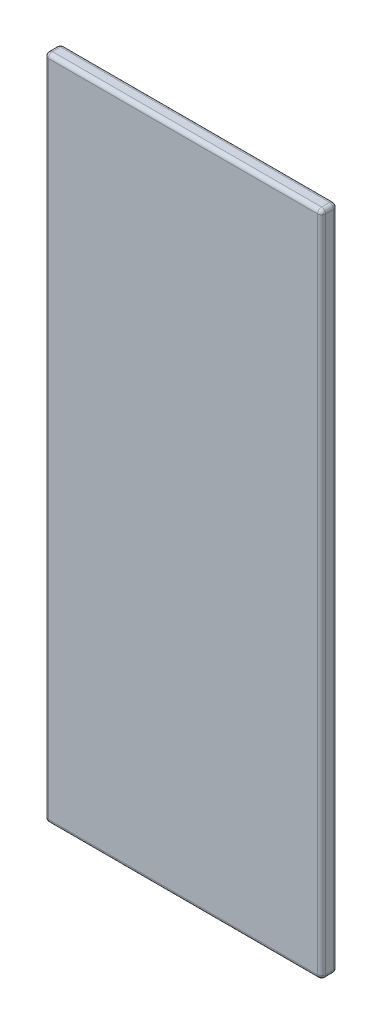
ISO-10303-21;
HEADER;
FILE_DESCRIPTION(('STEP AP214'),'2;1');
FILE_NAME('part.step','',(''),(''),'','','');
FILE_SCHEMA(('AUTOMOTIVE_DESIGN { 1 0 10303 214 1 1 1 1 }'));
ENDSEC;
DATA;
#1=APPLICATION_CONTEXT('core data for automotive mechanical design processes');
#2=APPLICATION_PROTOCOL_DEFINITION('international standard','automotive_design',2000,#1);
#3=PRODUCT_CONTEXT('',#1,'mechanical');
#4=PRODUCT('Part','Part','',(#3));
#5=PRODUCT_RELATED_PRODUCT_CATEGORY('part','',(#4));
#6=PRODUCT_DEFINITION_FORMATION('','',#4);
#7=PRODUCT_DEFINITION_CONTEXT('part definition',#1,'design');
#8=PRODUCT_DEFINITION('design','',#6,#7);
#9=PRODUCT_DEFINITION_SHAPE('','',#8);
#10=(LENGTH_UNIT() NAMED_UNIT(*) SI_UNIT(.MILLI.,.METRE.));
#11=(NAMED_UNIT(*) PLANE_ANGLE_UNIT() SI_UNIT($,.RADIAN.));
#12=(NAMED_UNIT(*) SI_UNIT($,.STERADIAN.) SOLID_ANGLE_UNIT());
#13=UNCERTAINTY_MEASURE_WITH_UNIT(LENGTH_MEASURE(1.E-05),#10,'distance_accuracy_value','');
#14=(GEOMETRIC_REPRESENTATION_CONTEXT(3) GLOBAL_UNCERTAINTY_ASSIGNED_CONTEXT((#13)) GLOBAL_UNIT_ASSIGNED_CONTEXT((#10,
#11,#12)) REPRESENTATION_CONTEXT('',''));
#15=CARTESIAN_POINT('',(0.,0.,0.));
#16=DIRECTION('',(0.,0.,1.));
#17=DIRECTION('',(1.,0.,0.));
#18=AXIS2_PLACEMENT_3D('',#15,#16,#17);
#19=CARTESIAN_POINT('',(17.35,-41.75,2.));
#20=DIRECTION('',(-1.,0.,0.));
#21=DIRECTION('',(0.,0.,1.));
#22=AXIS2_PLACEMENT_3D('',#19,#20,#21);
#23=PLANE('',#22);
#24=DIRECTION('',(0.,1.,0.));
#25=VECTOR('',#24,1.);
#26=CARTESIAN_POINT('',(17.35,-41.75,1.5));
#27=LINE('',#26,#25);
#28=CARTESIAN_POINT('',(17.35,41.25,1.5));
#29=VERTEX_POINT('',#28);
#30=CARTESIAN_POINT('',(17.35,-41.25,1.5));
#31=VERTEX_POINT('',#30);
#32=EDGE_CURVE('E42',#29,#31,#27,.F.);
#33=ORIENTED_EDGE('',*,*,#32,.T.);
#34=DIRECTION('',(0.,0.,-1.));
#35=VECTOR('',#34,1.);
#36=CARTESIAN_POINT('',(17.35,-41.25,2.));
#37=LINE('',#36,#35);
#38=CARTESIAN_POINT('',(17.35,-41.25,0.5));
#39=VERTEX_POINT('',#38);
#40=EDGE_CURVE('E11',#31,#39,#37,.T.);
#41=ORIENTED_EDGE('',*,*,#40,.T.);
#42=DIRECTION('',(0.,1.,0.));
#43=VECTOR('',#42,1.);
#44=CARTESIAN_POINT('',(17.35,41.75,0.5));
#45=LINE('',#44,#43);
#46=CARTESIAN_POINT('',(17.35,41.25,0.5));
#47=VERTEX_POINT('',#46);
#48=EDGE_CURVE('E194',#39,#47,#45,.T.);
#49=ORIENTED_EDGE('',*,*,#48,.T.);
#50=DIRECTION('',(0.,0.,-1.));
#51=VECTOR('',#50,1.);
#52=CARTESIAN_POINT('',(17.35,41.25,2.));
#53=LINE('',#52,#51);
#54=EDGE_CURVE('E53',#47,#29,#53,.F.);
#55=ORIENTED_EDGE('',*,*,#54,.T.);
#56=EDGE_LOOP('',(#33,#41,#49,#55));
#57=FACE_BOUND('',#56,.T.);
#58=ADVANCED_FACE('F33',(#57),#23,.F.);
#59=CARTESIAN_POINT('',(-17.35,41.75,2.));
#60=DIRECTION('',(0.,-1.,0.));
#61=DIRECTION('',(0.,0.,-1.));
#62=AXIS2_PLACEMENT_3D('',#59,#60,#61);
#63=PLANE('',#62);
#64=DIRECTION('',(0.,0.,-1.));
#65=VECTOR('',#64,1.);
#66=CARTESIAN_POINT('',(-16.85,41.75,2.));
#67=LINE('',#66,#65);
#68=CARTESIAN_POINT('',(-16.85,41.75,0.5));
#69=VERTEX_POINT('',#68);
#70=CARTESIAN_POINT('',(-16.85,41.75,1.5));
#71=VERTEX_POINT('',#70);
#72=EDGE_CURVE('E189',#69,#71,#67,.F.);
#73=ORIENTED_EDGE('',*,*,#72,.T.);
#74=DIRECTION('',(-1.,0.,0.));
#75=VECTOR('',#74,1.);
#76=CARTESIAN_POINT('',(-17.35,41.75,1.5));
#77=LINE('',#76,#75);
#78=CARTESIAN_POINT('',(16.85,41.75,1.5));
#79=VERTEX_POINT('',#78);
#80=EDGE_CURVE('E191',#71,#79,#77,.F.);
#81=ORIENTED_EDGE('',*,*,#80,.T.);
#82=DIRECTION('',(0.,0.,-1.));
#83=VECTOR('',#82,1.);
#84=CARTESIAN_POINT('',(16.85,41.75,2.));
#85=LINE('',#84,#83);
#86=CARTESIAN_POINT('',(16.85,41.75,0.5));
#87=VERTEX_POINT('',#86);
#88=EDGE_CURVE('E185',#79,#87,#85,.T.);
#89=ORIENTED_EDGE('',*,*,#88,.T.);
#90=DIRECTION('',(-1.,0.,0.));
#91=VECTOR('',#90,1.);
#92=CARTESIAN_POINT('',(-17.35,41.75,0.5));
#93=LINE('',#92,#91);
#94=EDGE_CURVE('E187',#87,#69,#93,.T.);
#95=ORIENTED_EDGE('',*,*,#94,.T.);
#96=EDGE_LOOP('',(#73,#81,#89,#95));
#97=FACE_BOUND('',#96,.T.);
#98=ADVANCED_FACE('F278',(#97),#63,.F.);
#99=CARTESIAN_POINT('',(-17.35,-41.75,2.));
#100=DIRECTION('',(1.,0.,0.));
#101=DIRECTION('',(0.,0.,-1.));
#102=AXIS2_PLACEMENT_3D('',#99,#100,#101);
#103=PLANE('',#102);
#104=DIRECTION('',(0.,0.,-1.));
#105=VECTOR('',#104,1.);
#106=CARTESIAN_POINT('',(-17.35,-41.25,2.));
#107=LINE('',#106,#105);
#108=CARTESIAN_POINT('',(-17.35,-41.25,0.5));
#109=VERTEX_POINT('',#108);
#110=CARTESIAN_POINT('',(-17.35,-41.25,1.5));
#111=VERTEX_POINT('',#110);
#112=EDGE_CURVE('E180',#109,#111,#107,.F.);
#113=ORIENTED_EDGE('',*,*,#112,.T.);
#114=DIRECTION('',(0.,-1.,0.));
#115=VECTOR('',#114,1.);
#116=CARTESIAN_POINT('',(-17.35,-41.75,1.5));
#117=LINE('',#116,#115);
#118=CARTESIAN_POINT('',(-17.35,41.25,1.5));
#119=VERTEX_POINT('',#118);
#120=EDGE_CURVE('E182',#111,#119,#117,.F.);
#121=ORIENTED_EDGE('',*,*,#120,.T.);
#122=DIRECTION('',(0.,0.,-1.));
#123=VECTOR('',#122,1.);
#124=CARTESIAN_POINT('',(-17.35,41.25,2.));
#125=LINE('',#124,#123);
#126=CARTESIAN_POINT('',(-17.35,41.25,0.5));
#127=VERTEX_POINT('',#126);
#128=EDGE_CURVE('E176',#119,#127,#125,.T.);
#129=ORIENTED_EDGE('',*,*,#128,.T.);
#130=DIRECTION('',(0.,-1.,0.));
#131=VECTOR('',#130,1.);
#132=CARTESIAN_POINT('',(-17.35,-41.75,0.5));
#133=LINE('',#132,#131);
#134=EDGE_CURVE('E178',#127,#109,#133,.T.);
#135=ORIENTED_EDGE('',*,*,#134,.T.);
#136=EDGE_LOOP('',(#113,#121,#129,#135));
#137=FACE_BOUND('',#136,.T.);
#138=ADVANCED_FACE('F269',(#137),#103,.F.);
#139=CARTESIAN_POINT('',(-17.35,-41.75,2.));
#140=DIRECTION('',(0.,1.,0.));
#141=DIRECTION('',(0.,0.,1.));
#142=AXIS2_PLACEMENT_3D('',#139,#140,#141);
#143=PLANE('',#142);
#144=DIRECTION('',(1.,0.,0.));
#145=VECTOR('',#144,1.);
#146=CARTESIAN_POINT('',(-17.35,-41.75,1.5));
#147=LINE('',#146,#145);
#148=CARTESIAN_POINT('',(16.85,-41.75,1.5));
#149=VERTEX_POINT('',#148);
#150=CARTESIAN_POINT('',(-16.85,-41.75,1.5));
#151=VERTEX_POINT('',#150);
#152=EDGE_CURVE('E129',#149,#151,#147,.F.);
#153=ORIENTED_EDGE('',*,*,#152,.T.);
#154=DIRECTION('',(0.,0.,-1.));
#155=VECTOR('',#154,1.);
#156=CARTESIAN_POINT('',(-16.85,-41.75,2.));
#157=LINE('',#156,#155);
#158=CARTESIAN_POINT('',(-16.85,-41.75,0.5));
#159=VERTEX_POINT('',#158);
#160=EDGE_CURVE('E165',#151,#159,#157,.T.);
#161=ORIENTED_EDGE('',*,*,#160,.T.);
#162=DIRECTION('',(1.,0.,0.));
#163=VECTOR('',#162,1.);
#164=CARTESIAN_POINT('',(17.35,-41.75,0.5));
#165=LINE('',#164,#163);
#166=CARTESIAN_POINT('',(16.85,-41.75,0.5));
#167=VERTEX_POINT('',#166);
#168=EDGE_CURVE('E158',#159,#167,#165,.T.);
#169=ORIENTED_EDGE('',*,*,#168,.T.);
#170=DIRECTION('',(0.,0.,-1.));
#171=VECTOR('',#170,1.);
#172=CARTESIAN_POINT('',(16.85,-41.75,2.));
#173=LINE('',#172,#171);
#174=EDGE_CURVE('E156',#167,#149,#173,.F.);
#175=ORIENTED_EDGE('',*,*,#174,.T.);
#176=EDGE_LOOP('',(#153,#161,#169,#175));
#177=FACE_BOUND('',#176,.T.);
#178=ADVANCED_FACE('F356',(#177),#143,.F.);
#179=CARTESIAN_POINT('',(0.,0.,2.));
#180=DIRECTION('',(0.,0.,-1.));
#181=DIRECTION('',(-1.,0.,0.));
#182=AXIS2_PLACEMENT_3D('',#179,#180,#181);
#183=PLANE('',#182);
#184=DIRECTION('',(0.,-1.,0.));
#185=VECTOR('',#184,1.);
#186=CARTESIAN_POINT('',(-16.85,0.,2.));
#187=LINE('',#186,#185);
#188=CARTESIAN_POINT('',(-16.85,41.25,2.));
#189=VERTEX_POINT('',#188);
#190=CARTESIAN_POINT('',(-16.85,-41.25,2.));
#191=VERTEX_POINT('',#190);
#192=EDGE_CURVE('E154',#189,#191,#187,.T.);
#193=ORIENTED_EDGE('',*,*,#192,.T.);
#194=DIRECTION('',(1.,0.,0.));
#195=VECTOR('',#194,1.);
#196=CARTESIAN_POINT('',(0.,-41.25,2.));
#197=LINE('',#196,#195);
#198=CARTESIAN_POINT('',(16.85,-41.25,2.));
#199=VERTEX_POINT('',#198);
#200=EDGE_CURVE('E127',#191,#199,#197,.T.);
#201=ORIENTED_EDGE('',*,*,#200,.T.);
#202=DIRECTION('',(0.,1.,0.));
#203=VECTOR('',#202,1.);
#204=CARTESIAN_POINT('',(16.85,0.,2.));
#205=LINE('',#204,#203);
#206=CARTESIAN_POINT('',(16.85,41.25,2.));
#207=VERTEX_POINT('',#206);
#208=EDGE_CURVE('E144',#199,#207,#205,.T.);
#209=ORIENTED_EDGE('',*,*,#208,.T.);
#210=DIRECTION('',(-1.,0.,0.));
#211=VECTOR('',#210,1.);
#212=CARTESIAN_POINT('',(0.,41.25,2.));
#213=LINE('',#212,#211);
#214=EDGE_CURVE('E150',#207,#189,#213,.T.);
#215=ORIENTED_EDGE('',*,*,#214,.T.);
#216=EDGE_LOOP('',(#193,#201,#209,#215));
#217=FACE_BOUND('',#216,.T.);
#218=ADVANCED_FACE('F152',(#217),#183,.F.);
#219=CARTESIAN_POINT('',(0.,0.,0.));
#220=DIRECTION('',(0.,0.,-1.));
#221=DIRECTION('',(-1.,0.,0.));
#222=AXIS2_PLACEMENT_3D('',#219,#220,#221);
#223=PLANE('',#222);
#224=DIRECTION('',(0.,1.,0.));
#225=VECTOR('',#224,1.);
#226=CARTESIAN_POINT('',(16.85,-41.75,0.));
#227=LINE('',#226,#225);
#228=CARTESIAN_POINT('',(16.85,41.25,0.));
#229=VERTEX_POINT('',#228);
#230=CARTESIAN_POINT('',(16.85,-41.25,0.));
#231=VERTEX_POINT('',#230);
#232=EDGE_CURVE('E167',#229,#231,#227,.F.);
#233=ORIENTED_EDGE('',*,*,#232,.T.);
#234=DIRECTION('',(1.,0.,0.));
#235=VECTOR('',#234,1.);
#236=CARTESIAN_POINT('',(-17.35,-41.25,0.));
#237=LINE('',#236,#235);
#238=CARTESIAN_POINT('',(-16.85,-41.25,0.));
#239=VERTEX_POINT('',#238);
#240=EDGE_CURVE('E173',#231,#239,#237,.F.);
#241=ORIENTED_EDGE('',*,*,#240,.T.);
#242=DIRECTION('',(0.,-1.,0.));
#243=VECTOR('',#242,1.);
#244=CARTESIAN_POINT('',(-16.85,41.75,0.));
#245=LINE('',#244,#243);
#246=CARTESIAN_POINT('',(-16.85,41.25,0.));
#247=VERTEX_POINT('',#246);
#248=EDGE_CURVE('E171',#239,#247,#245,.F.);
#249=ORIENTED_EDGE('',*,*,#248,.T.);
#250=DIRECTION('',(-1.,0.,0.));
#251=VECTOR('',#250,1.);
#252=CARTESIAN_POINT('',(17.35,41.25,0.));
#253=LINE('',#252,#251);
#254=EDGE_CURVE('E169',#247,#229,#253,.F.);
#255=ORIENTED_EDGE('',*,*,#254,.T.);
#256=EDGE_LOOP('',(#233,#241,#249,#255));
#257=FACE_BOUND('',#256,.T.);
#258=ADVANCED_FACE('F296',(#257),#223,.T.);
#259=CARTESIAN_POINT('',(-17.35,41.25,0.5));
#260=DIRECTION('',(1.,0.,0.));
#261=DIRECTION('',(0.,0.,-1.));
#262=AXIS2_PLACEMENT_3D('',#259,#260,#261);
#263=CYLINDRICAL_SURFACE('',#262,0.5);
#264=CARTESIAN_POINT('',(-16.85,41.25,0.5));
#265=DIRECTION('',(-1.,0.,0.));
#266=DIRECTION('',(0.,0.,1.));
#267=AXIS2_PLACEMENT_3D('',#264,#265,#266);
#268=CIRCLE('',#267,0.5);
#269=EDGE_CURVE('E37',#69,#247,#268,.T.);
#270=ORIENTED_EDGE('',*,*,#269,.F.);
#271=ORIENTED_EDGE('',*,*,#94,.F.);
#272=CARTESIAN_POINT('',(16.85,41.25,0.5));
#273=DIRECTION('',(1.,0.,0.));
#274=DIRECTION('',(0.,0.,-1.));
#275=AXIS2_PLACEMENT_3D('',#272,#273,#274);
#276=CIRCLE('',#275,0.5);
#277=EDGE_CURVE('E246',#229,#87,#276,.T.);
#278=ORIENTED_EDGE('',*,*,#277,.F.);
#279=ORIENTED_EDGE('',*,*,#254,.F.);
#280=EDGE_LOOP('',(#270,#271,#278,#279));
#281=FACE_BOUND('',#280,.T.);
#282=ADVANCED_FACE('F35',(#281),#263,.T.);
#283=CARTESIAN_POINT('',(-16.85,41.25,0.5));
#284=DIRECTION('',(0.,0.,1.));
#285=DIRECTION('',(1.,0.,0.));
#286=AXIS2_PLACEMENT_3D('',#283,#284,#285);
#287=SPHERICAL_SURFACE('',#286,0.5);
#288=CARTESIAN_POINT('',(-16.85,41.25,0.5));
#289=DIRECTION('',(0.,0.,-1.));
#290=DIRECTION('',(-1.,0.,0.));
#291=AXIS2_PLACEMENT_3D('',#288,#289,#290);
#292=CIRCLE('',#291,0.5);
#293=EDGE_CURVE('E241',#69,#127,#292,.F.);
#294=ORIENTED_EDGE('',*,*,#293,.F.);
#295=ORIENTED_EDGE('',*,*,#269,.T.);
#296=CARTESIAN_POINT('',(-16.85,41.25,0.5));
#297=DIRECTION('',(0.,1.,0.));
#298=DIRECTION('',(0.,0.,1.));
#299=AXIS2_PLACEMENT_3D('',#296,#297,#298);
#300=CIRCLE('',#299,0.5);
#301=EDGE_CURVE('E244',#127,#247,#300,.F.);
#302=ORIENTED_EDGE('',*,*,#301,.F.);
#303=EDGE_LOOP('',(#294,#295,#302));
#304=FACE_BOUND('',#303,.T.);
#305=ADVANCED_FACE('F257',(#304),#287,.T.);
#306=CARTESIAN_POINT('',(16.85,41.25,0.5));
#307=DIRECTION('',(0.,0.,1.));
#308=DIRECTION('',(1.,0.,0.));
#309=AXIS2_PLACEMENT_3D('',#306,#307,#308);
#310=SPHERICAL_SURFACE('',#309,0.5);
#311=CARTESIAN_POINT('',(16.85,41.25,0.5));
#312=DIRECTION('',(0.,1.,0.));
#313=DIRECTION('',(0.,0.,1.));
#314=AXIS2_PLACEMENT_3D('',#311,#312,#313);
#315=CIRCLE('',#314,0.5);
#316=EDGE_CURVE('E235',#229,#47,#315,.F.);
#317=ORIENTED_EDGE('',*,*,#316,.F.);
#318=ORIENTED_EDGE('',*,*,#277,.T.);
#319=CARTESIAN_POINT('',(16.85,41.25,0.5));
#320=DIRECTION('',(0.,0.,-1.));
#321=DIRECTION('',(-1.,0.,0.));
#322=AXIS2_PLACEMENT_3D('',#319,#320,#321);
#323=CIRCLE('',#322,0.5);
#324=EDGE_CURVE('E238',#47,#87,#323,.F.);
#325=ORIENTED_EDGE('',*,*,#324,.F.);
#326=EDGE_LOOP('',(#317,#318,#325));
#327=FACE_BOUND('',#326,.T.);
#328=ADVANCED_FACE('F289',(#327),#310,.T.);
#329=CARTESIAN_POINT('',(-16.85,-41.75,0.5));
#330=DIRECTION('',(0.,1.,0.));
#331=DIRECTION('',(0.,0.,1.));
#332=AXIS2_PLACEMENT_3D('',#329,#330,#331);
#333=CYLINDRICAL_SURFACE('',#332,0.5);
#334=ORIENTED_EDGE('',*,*,#301,.T.);
#335=ORIENTED_EDGE('',*,*,#248,.F.);
#336=CARTESIAN_POINT('',(-16.85,-41.25,0.5));
#337=DIRECTION('',(0.,-1.,0.));
#338=DIRECTION('',(0.,0.,-1.));
#339=AXIS2_PLACEMENT_3D('',#336,#337,#338);
#340=CIRCLE('',#339,0.5);
#341=EDGE_CURVE('E230',#109,#239,#340,.T.);
#342=ORIENTED_EDGE('',*,*,#341,.F.);
#343=ORIENTED_EDGE('',*,*,#134,.F.);
#344=EDGE_LOOP('',(#334,#335,#342,#343));
#345=FACE_BOUND('',#344,.T.);
#346=ADVANCED_FACE('F265',(#345),#333,.T.);
#347=CARTESIAN_POINT('',(-16.85,41.25,2.));
#348=DIRECTION('',(0.,0.,-1.));
#349=DIRECTION('',(-1.,0.,0.));
#350=AXIS2_PLACEMENT_3D('',#347,#348,#349);
#351=CYLINDRICAL_SURFACE('',#350,0.5);
#352=ORIENTED_EDGE('',*,*,#293,.T.);
#353=ORIENTED_EDGE('',*,*,#128,.F.);
#354=CARTESIAN_POINT('',(-16.85,41.25,1.5));
#355=DIRECTION('',(0.,0.,1.));
#356=DIRECTION('',(1.,0.,0.));
#357=AXIS2_PLACEMENT_3D('',#354,#355,#356);
#358=CIRCLE('',#357,0.5);
#359=EDGE_CURVE('E227',#71,#119,#358,.T.);
#360=ORIENTED_EDGE('',*,*,#359,.F.);
#361=ORIENTED_EDGE('',*,*,#72,.F.);
#362=EDGE_LOOP('',(#352,#353,#360,#361));
#363=FACE_BOUND('',#362,.T.);
#364=ADVANCED_FACE('F275',(#363),#351,.T.);
#365=CARTESIAN_POINT('',(0.,41.25,1.5));
#366=DIRECTION('',(-1.,0.,0.));
#367=DIRECTION('',(0.,0.,1.));
#368=AXIS2_PLACEMENT_3D('',#365,#366,#367);
#369=CYLINDRICAL_SURFACE('',#368,0.5);
#370=CARTESIAN_POINT('',(16.85,41.25,1.5));
#371=DIRECTION('',(1.,0.,0.));
#372=DIRECTION('',(0.,0.,-1.));
#373=AXIS2_PLACEMENT_3D('',#370,#371,#372);
#374=CIRCLE('',#373,0.5);
#375=EDGE_CURVE('E221',#79,#207,#374,.T.);
#376=ORIENTED_EDGE('',*,*,#375,.F.);
#377=ORIENTED_EDGE('',*,*,#80,.F.);
#378=CARTESIAN_POINT('',(-16.85,41.25,1.5));
#379=DIRECTION('',(-1.,0.,0.));
#380=DIRECTION('',(0.,0.,1.));
#381=AXIS2_PLACEMENT_3D('',#378,#379,#380);
#382=CIRCLE('',#381,0.5);
#383=EDGE_CURVE('E224',#189,#71,#382,.T.);
#384=ORIENTED_EDGE('',*,*,#383,.F.);
#385=ORIENTED_EDGE('',*,*,#214,.F.);
#386=EDGE_LOOP('',(#376,#377,#384,#385));
#387=FACE_BOUND('',#386,.T.);
#388=ADVANCED_FACE('F282',(#387),#369,.T.);
#389=CARTESIAN_POINT('',(16.85,41.25,2.));
#390=DIRECTION('',(0.,0.,-1.));
#391=DIRECTION('',(-1.,0.,0.));
#392=AXIS2_PLACEMENT_3D('',#389,#390,#391);
#393=CYLINDRICAL_SURFACE('',#392,0.5);
#394=ORIENTED_EDGE('',*,*,#324,.T.);
#395=ORIENTED_EDGE('',*,*,#88,.F.);
#396=CARTESIAN_POINT('',(16.85,41.25,1.5));
#397=DIRECTION('',(0.,0.,1.));
#398=DIRECTION('',(1.,0.,0.));
#399=AXIS2_PLACEMENT_3D('',#396,#397,#398);
#400=CIRCLE('',#399,0.5);
#401=EDGE_CURVE('E219',#29,#79,#400,.T.);
#402=ORIENTED_EDGE('',*,*,#401,.F.);
#403=ORIENTED_EDGE('',*,*,#54,.F.);
#404=EDGE_LOOP('',(#394,#395,#402,#403));
#405=FACE_BOUND('',#404,.T.);
#406=ADVANCED_FACE('F287',(#405),#393,.T.);
#407=CARTESIAN_POINT('',(16.85,-41.75,0.5));
#408=DIRECTION('',(0.,-1.,0.));
#409=DIRECTION('',(0.,0.,-1.));
#410=AXIS2_PLACEMENT_3D('',#407,#408,#409);
#411=CYLINDRICAL_SURFACE('',#410,0.5);
#412=ORIENTED_EDGE('',*,*,#316,.T.);
#413=ORIENTED_EDGE('',*,*,#48,.F.);
#414=CARTESIAN_POINT('',(16.85,-41.25,0.5));
#415=DIRECTION('',(0.,-1.,0.));
#416=DIRECTION('',(0.,0.,-1.));
#417=AXIS2_PLACEMENT_3D('',#414,#415,#416);
#418=CIRCLE('',#417,0.5);
#419=EDGE_CURVE('E216',#231,#39,#418,.T.);
#420=ORIENTED_EDGE('',*,*,#419,.F.);
#421=ORIENTED_EDGE('',*,*,#232,.F.);
#422=EDGE_LOOP('',(#412,#413,#420,#421));
#423=FACE_BOUND('',#422,.T.);
#424=ADVANCED_FACE('F293',(#423),#411,.T.);
#425=CARTESIAN_POINT('',(-17.35,-41.25,0.5));
#426=DIRECTION('',(-1.,0.,0.));
#427=DIRECTION('',(0.,0.,1.));
#428=AXIS2_PLACEMENT_3D('',#425,#426,#427);
#429=CYLINDRICAL_SURFACE('',#428,0.5);
#430=CARTESIAN_POINT('',(-16.85,-41.25,0.5));
#431=DIRECTION('',(-1.,0.,0.));
#432=DIRECTION('',(0.,0.,1.));
#433=AXIS2_PLACEMENT_3D('',#430,#431,#432);
#434=CIRCLE('',#433,0.5);
#435=EDGE_CURVE('E232',#239,#159,#434,.T.);
#436=ORIENTED_EDGE('',*,*,#435,.F.);
#437=ORIENTED_EDGE('',*,*,#240,.F.);
#438=CARTESIAN_POINT('',(16.85,-41.25,0.5));
#439=DIRECTION('',(1.,0.,0.));
#440=DIRECTION('',(0.,0.,-1.));
#441=AXIS2_PLACEMENT_3D('',#438,#439,#440);
#442=CIRCLE('',#441,0.5);
#443=EDGE_CURVE('E213',#167,#231,#442,.T.);
#444=ORIENTED_EDGE('',*,*,#443,.F.);
#445=ORIENTED_EDGE('',*,*,#168,.F.);
#446=EDGE_LOOP('',(#436,#437,#444,#445));
#447=FACE_BOUND('',#446,.T.);
#448=ADVANCED_FACE('F300',(#447),#429,.T.);
#449=CARTESIAN_POINT('',(-16.85,-41.25,0.5));
#450=DIRECTION('',(0.,0.,1.));
#451=DIRECTION('',(1.,0.,0.));
#452=AXIS2_PLACEMENT_3D('',#449,#450,#451);
#453=SPHERICAL_SURFACE('',#452,0.5);
#454=ORIENTED_EDGE('',*,*,#341,.T.);
#455=ORIENTED_EDGE('',*,*,#435,.T.);
#456=CARTESIAN_POINT('',(-16.85,-41.25,0.5));
#457=DIRECTION('',(0.,0.,-1.));
#458=DIRECTION('',(-1.,0.,0.));
#459=AXIS2_PLACEMENT_3D('',#456,#457,#458);
#460=CIRCLE('',#459,0.5);
#461=EDGE_CURVE('E210',#109,#159,#460,.F.);
#462=ORIENTED_EDGE('',*,*,#461,.F.);
#463=EDGE_LOOP('',(#454,#455,#462));
#464=FACE_BOUND('',#463,.T.);
#465=ADVANCED_FACE('F304',(#464),#453,.T.);
#466=CARTESIAN_POINT('',(-16.85,41.25,1.5));
#467=DIRECTION('',(0.,0.,1.));
#468=DIRECTION('',(1.,0.,0.));
#469=AXIS2_PLACEMENT_3D('',#466,#467,#468);
#470=SPHERICAL_SURFACE('',#469,0.5);
#471=ORIENTED_EDGE('',*,*,#383,.T.);
#472=ORIENTED_EDGE('',*,*,#359,.T.);
#473=CARTESIAN_POINT('',(-16.85,41.25,1.5));
#474=DIRECTION('',(0.,1.,0.));
#475=DIRECTION('',(0.,0.,1.));
#476=AXIS2_PLACEMENT_3D('',#473,#474,#475);
#477=CIRCLE('',#476,0.5);
#478=EDGE_CURVE('E208',#189,#119,#477,.F.);
#479=ORIENTED_EDGE('',*,*,#478,.F.);
#480=EDGE_LOOP('',(#471,#472,#479));
#481=FACE_BOUND('',#480,.T.);
#482=ADVANCED_FACE('F315',(#481),#470,.T.);
#483=CARTESIAN_POINT('',(16.85,41.25,1.5));
#484=DIRECTION('',(0.,0.,1.));
#485=DIRECTION('',(1.,0.,0.));
#486=AXIS2_PLACEMENT_3D('',#483,#484,#485);
#487=SPHERICAL_SURFACE('',#486,0.5);
#488=ORIENTED_EDGE('',*,*,#401,.T.);
#489=ORIENTED_EDGE('',*,*,#375,.T.);
#490=CARTESIAN_POINT('',(16.85,41.25,1.5));
#491=DIRECTION('',(0.,1.,0.));
#492=DIRECTION('',(0.,0.,1.));
#493=AXIS2_PLACEMENT_3D('',#490,#491,#492);
#494=CIRCLE('',#493,0.5);
#495=EDGE_CURVE('E147',#29,#207,#494,.F.);
#496=ORIENTED_EDGE('',*,*,#495,.F.);
#497=EDGE_LOOP('',(#488,#489,#496));
#498=FACE_BOUND('',#497,.T.);
#499=ADVANCED_FACE('F317',(#498),#487,.T.);
#500=CARTESIAN_POINT('',(16.85,-41.25,0.5));
#501=DIRECTION('',(0.,0.,1.));
#502=DIRECTION('',(1.,0.,0.));
#503=AXIS2_PLACEMENT_3D('',#500,#501,#502);
#504=SPHERICAL_SURFACE('',#503,0.5);
#505=ORIENTED_EDGE('',*,*,#443,.T.);
#506=ORIENTED_EDGE('',*,*,#419,.T.);
#507=CARTESIAN_POINT('',(16.85,-41.25,0.5));
#508=DIRECTION('',(0.,0.,-1.));
#509=DIRECTION('',(-1.,0.,0.));
#510=AXIS2_PLACEMENT_3D('',#507,#508,#509);
#511=CIRCLE('',#510,0.5);
#512=EDGE_CURVE('E205',#167,#39,#511,.F.);
#513=ORIENTED_EDGE('',*,*,#512,.F.);
#514=EDGE_LOOP('',(#505,#506,#513));
#515=FACE_BOUND('',#514,.T.);
#516=ADVANCED_FACE('F323',(#515),#504,.T.);
#517=CARTESIAN_POINT('',(-16.85,-41.25,2.));
#518=DIRECTION('',(0.,0.,-1.));
#519=DIRECTION('',(-1.,0.,0.));
#520=AXIS2_PLACEMENT_3D('',#517,#518,#519);
#521=CYLINDRICAL_SURFACE('',#520,0.5);
#522=ORIENTED_EDGE('',*,*,#461,.T.);
#523=ORIENTED_EDGE('',*,*,#160,.F.);
#524=CARTESIAN_POINT('',(-16.85,-41.25,1.5));
#525=DIRECTION('',(0.,0.,1.));
#526=DIRECTION('',(1.,0.,0.));
#527=AXIS2_PLACEMENT_3D('',#524,#525,#526);
#528=CIRCLE('',#527,0.5);
#529=EDGE_CURVE('E202',#111,#151,#528,.T.);
#530=ORIENTED_EDGE('',*,*,#529,.F.);
#531=ORIENTED_EDGE('',*,*,#112,.F.);
#532=EDGE_LOOP('',(#522,#523,#530,#531));
#533=FACE_BOUND('',#532,.T.);
#534=ADVANCED_FACE('F307',(#533),#521,.T.);
#535=CARTESIAN_POINT('',(-16.85,0.,1.5));
#536=DIRECTION('',(0.,-1.,0.));
#537=DIRECTION('',(0.,0.,-1.));
#538=AXIS2_PLACEMENT_3D('',#535,#536,#537);
#539=CYLINDRICAL_SURFACE('',#538,0.5);
#540=ORIENTED_EDGE('',*,*,#478,.T.);
#541=ORIENTED_EDGE('',*,*,#120,.F.);
#542=CARTESIAN_POINT('',(-16.85,-41.25,1.5));
#543=DIRECTION('',(0.,-1.,0.));
#544=DIRECTION('',(0.,0.,-1.));
#545=AXIS2_PLACEMENT_3D('',#542,#543,#544);
#546=CIRCLE('',#545,0.5);
#547=EDGE_CURVE('E141',#191,#111,#546,.T.);
#548=ORIENTED_EDGE('',*,*,#547,.F.);
#549=ORIENTED_EDGE('',*,*,#192,.F.);
#550=EDGE_LOOP('',(#540,#541,#548,#549));
#551=FACE_BOUND('',#550,.T.);
#552=ADVANCED_FACE('F313',(#551),#539,.T.);
#553=CARTESIAN_POINT('',(16.85,0.,1.5));
#554=DIRECTION('',(0.,1.,0.));
#555=DIRECTION('',(0.,0.,1.));
#556=AXIS2_PLACEMENT_3D('',#553,#554,#555);
#557=CYLINDRICAL_SURFACE('',#556,0.5);
#558=ORIENTED_EDGE('',*,*,#495,.T.);
#559=ORIENTED_EDGE('',*,*,#208,.F.);
#560=CARTESIAN_POINT('',(16.85,-41.25,1.5));
#561=DIRECTION('',(0.,-1.,0.));
#562=DIRECTION('',(0.,0.,-1.));
#563=AXIS2_PLACEMENT_3D('',#560,#561,#562);
#564=CIRCLE('',#563,0.5);
#565=EDGE_CURVE('E135',#31,#199,#564,.T.);
#566=ORIENTED_EDGE('',*,*,#565,.F.);
#567=ORIENTED_EDGE('',*,*,#32,.F.);
#568=EDGE_LOOP('',(#558,#559,#566,#567));
#569=FACE_BOUND('',#568,.T.);
#570=ADVANCED_FACE('F145',(#569),#557,.T.);
#571=CARTESIAN_POINT('',(16.85,-41.25,2.));
#572=DIRECTION('',(0.,0.,-1.));
#573=DIRECTION('',(-1.,0.,0.));
#574=AXIS2_PLACEMENT_3D('',#571,#572,#573);
#575=CYLINDRICAL_SURFACE('',#574,0.5);
#576=ORIENTED_EDGE('',*,*,#512,.T.);
#577=ORIENTED_EDGE('',*,*,#40,.F.);
#578=CARTESIAN_POINT('',(16.85,-41.25,1.5));
#579=DIRECTION('',(0.,0.,1.));
#580=DIRECTION('',(1.,0.,0.));
#581=AXIS2_PLACEMENT_3D('',#578,#579,#580);
#582=CIRCLE('',#581,0.5);
#583=EDGE_CURVE('E139',#149,#31,#582,.T.);
#584=ORIENTED_EDGE('',*,*,#583,.F.);
#585=ORIENTED_EDGE('',*,*,#174,.F.);
#586=EDGE_LOOP('',(#576,#577,#584,#585));
#587=FACE_BOUND('',#586,.T.);
#588=ADVANCED_FACE('F340',(#587),#575,.T.);
#589=CARTESIAN_POINT('',(-16.85,-41.25,1.5));
#590=DIRECTION('',(0.,0.,1.));
#591=DIRECTION('',(1.,0.,0.));
#592=AXIS2_PLACEMENT_3D('',#589,#590,#591);
#593=SPHERICAL_SURFACE('',#592,0.5);
#594=ORIENTED_EDGE('',*,*,#547,.T.);
#595=ORIENTED_EDGE('',*,*,#529,.T.);
#596=CARTESIAN_POINT('',(-16.85,-41.25,1.5));
#597=DIRECTION('',(-1.,0.,0.));
#598=DIRECTION('',(0.,0.,1.));
#599=AXIS2_PLACEMENT_3D('',#596,#597,#598);
#600=CIRCLE('',#599,0.5);
#601=EDGE_CURVE('E132',#191,#151,#600,.F.);
#602=ORIENTED_EDGE('',*,*,#601,.F.);
#603=EDGE_LOOP('',(#594,#595,#602));
#604=FACE_BOUND('',#603,.T.);
#605=ADVANCED_FACE('F311',(#604),#593,.T.);
#606=CARTESIAN_POINT('',(16.85,-41.25,1.5));
#607=DIRECTION('',(0.,0.,1.));
#608=DIRECTION('',(1.,0.,0.));
#609=AXIS2_PLACEMENT_3D('',#606,#607,#608);
#610=SPHERICAL_SURFACE('',#609,0.5);
#611=ORIENTED_EDGE('',*,*,#583,.T.);
#612=ORIENTED_EDGE('',*,*,#565,.T.);
#613=CARTESIAN_POINT('',(16.85,-41.25,1.5));
#614=DIRECTION('',(1.,0.,0.));
#615=DIRECTION('',(0.,0.,-1.));
#616=AXIS2_PLACEMENT_3D('',#613,#614,#615);
#617=CIRCLE('',#616,0.5);
#618=EDGE_CURVE('E123',#149,#199,#617,.F.);
#619=ORIENTED_EDGE('',*,*,#618,.F.);
#620=EDGE_LOOP('',(#611,#612,#619));
#621=FACE_BOUND('',#620,.T.);
#622=ADVANCED_FACE('F137',(#621),#610,.T.);
#623=CARTESIAN_POINT('',(0.,-41.25,1.5));
#624=DIRECTION('',(1.,0.,0.));
#625=DIRECTION('',(0.,0.,-1.));
#626=AXIS2_PLACEMENT_3D('',#623,#624,#625);
#627=CYLINDRICAL_SURFACE('',#626,0.5);
#628=ORIENTED_EDGE('',*,*,#601,.T.);
#629=ORIENTED_EDGE('',*,*,#152,.F.);
#630=ORIENTED_EDGE('',*,*,#618,.T.);
#631=ORIENTED_EDGE('',*,*,#200,.F.);
#632=EDGE_LOOP('',(#628,#629,#630,#631));
#633=FACE_BOUND('',#632,.T.);
#634=ADVANCED_FACE('F125',(#633),#627,.T.);
#635=CLOSED_SHELL('',(#58,#98,#138,#178,#218,#258,#282,#305,#328,#346,#364,#388,#406,#424,#448,
#465,#482,#499,#516,#534,#552,#570,#588,#605,#622,#634));
#636=MANIFOLD_SOLID_BREP('B2',#635);
#637=ADVANCED_BREP_SHAPE_REPRESENTATION('',(#18,#636),#14);
#638=SHAPE_DEFINITION_REPRESENTATION(#9,#637);
ENDSEC;
END-ISO-10303-21;
